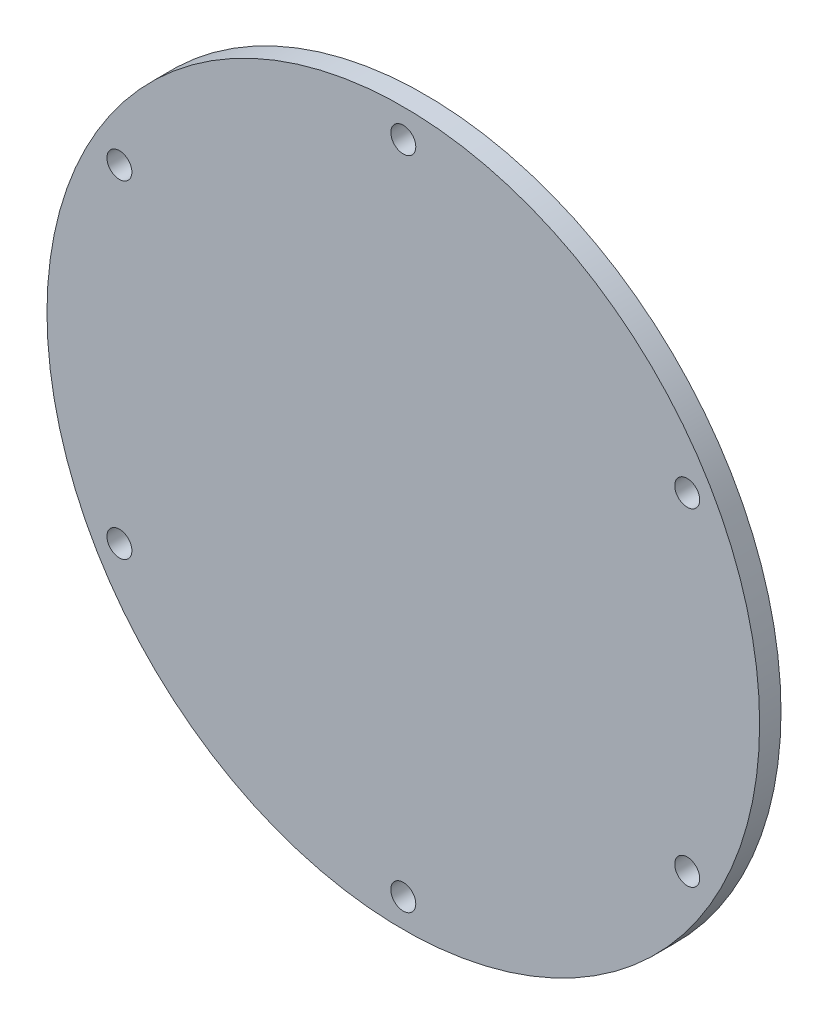
ISO-10303-21;
HEADER;
FILE_DESCRIPTION(('STEP AP214'),'2;1');
FILE_NAME('part.step','',(''),(''),'','','');
FILE_SCHEMA(('AUTOMOTIVE_DESIGN { 1 0 10303 214 1 1 1 1 }'));
ENDSEC;
DATA;
#1=APPLICATION_CONTEXT('core data for automotive mechanical design processes');
#2=APPLICATION_PROTOCOL_DEFINITION('international standard','automotive_design',2000,#1);
#3=PRODUCT_CONTEXT('',#1,'mechanical');
#4=PRODUCT('Part','Part','',(#3));
#5=PRODUCT_RELATED_PRODUCT_CATEGORY('part','',(#4));
#6=PRODUCT_DEFINITION_FORMATION('','',#4);
#7=PRODUCT_DEFINITION_CONTEXT('part definition',#1,'design');
#8=PRODUCT_DEFINITION('design','',#6,#7);
#9=PRODUCT_DEFINITION_SHAPE('','',#8);
#10=(LENGTH_UNIT() NAMED_UNIT(*) SI_UNIT(.MILLI.,.METRE.));
#11=(NAMED_UNIT(*) PLANE_ANGLE_UNIT() SI_UNIT($,.RADIAN.));
#12=(NAMED_UNIT(*) SI_UNIT($,.STERADIAN.) SOLID_ANGLE_UNIT());
#13=UNCERTAINTY_MEASURE_WITH_UNIT(LENGTH_MEASURE(1.E-05),#10,'distance_accuracy_value','');
#14=(GEOMETRIC_REPRESENTATION_CONTEXT(3) GLOBAL_UNCERTAINTY_ASSIGNED_CONTEXT((#13)) GLOBAL_UNIT_ASSIGNED_CONTEXT((#10,
#11,#12)) REPRESENTATION_CONTEXT('',''));
#15=CARTESIAN_POINT('',(0.,0.,0.));
#16=DIRECTION('',(0.,0.,1.));
#17=DIRECTION('',(1.,0.,0.));
#18=AXIS2_PLACEMENT_3D('',#15,#16,#17);
#19=CARTESIAN_POINT('',(0.,0.,3.));
#20=DIRECTION('',(0.,0.,1.));
#21=DIRECTION('',(1.,0.,0.));
#22=AXIS2_PLACEMENT_3D('',#19,#20,#21);
#23=PLANE('',#22);
#24=CARTESIAN_POINT('',(-39.8371685740842,-23.,3.));
#25=DIRECTION('',(0.,0.,1.));
#26=DIRECTION('',(1.,0.,0.));
#27=AXIS2_PLACEMENT_3D('',#24,#25,#26);
#28=CIRCLE('',#27,1.75);
#29=CARTESIAN_POINT('',(-38.0871685740842,-23.,3.));
#30=VERTEX_POINT('',#29);
#31=EDGE_CURVE('E67',#30,#30,#28,.T.);
#32=ORIENTED_EDGE('',*,*,#31,.F.);
#33=EDGE_LOOP('',(#32));
#34=FACE_BOUND('',#33,.T.);
#35=CARTESIAN_POINT('',(39.8371685740842,-23.,3.));
#36=DIRECTION('',(0.,0.,1.));
#37=DIRECTION('',(1.,0.,0.));
#38=AXIS2_PLACEMENT_3D('',#35,#36,#37);
#39=CIRCLE('',#38,1.75);
#40=CARTESIAN_POINT('',(41.5871685740842,-23.,3.));
#41=VERTEX_POINT('',#40);
#42=EDGE_CURVE('E55',#41,#41,#39,.T.);
#43=ORIENTED_EDGE('',*,*,#42,.F.);
#44=EDGE_LOOP('',(#43));
#45=FACE_BOUND('',#44,.T.);
#46=CARTESIAN_POINT('',(0.,46.,3.));
#47=DIRECTION('',(0.,0.,1.));
#48=DIRECTION('',(1.,0.,0.));
#49=AXIS2_PLACEMENT_3D('',#46,#47,#48);
#50=CIRCLE('',#49,1.75);
#51=CARTESIAN_POINT('',(1.75,46.,3.));
#52=VERTEX_POINT('',#51);
#53=EDGE_CURVE('E44',#52,#52,#50,.T.);
#54=ORIENTED_EDGE('',*,*,#53,.F.);
#55=EDGE_LOOP('',(#54));
#56=FACE_BOUND('',#55,.T.);
#57=CARTESIAN_POINT('',(0.,0.,3.));
#58=DIRECTION('',(0.,0.,1.));
#59=DIRECTION('',(1.,0.,0.));
#60=AXIS2_PLACEMENT_3D('',#57,#58,#59);
#61=CIRCLE('',#60,50.);
#62=CARTESIAN_POINT('',(50.,0.,3.));
#63=VERTEX_POINT('',#62);
#64=EDGE_CURVE('E10',#63,#63,#61,.T.);
#65=ORIENTED_EDGE('',*,*,#64,.T.);
#66=EDGE_LOOP('',(#65));
#67=FACE_BOUND('',#66,.T.);
#68=CARTESIAN_POINT('',(39.8371685740842,23.,3.));
#69=DIRECTION('',(0.,0.,1.));
#70=DIRECTION('',(1.,0.,0.));
#71=AXIS2_PLACEMENT_3D('',#68,#69,#70);
#72=CIRCLE('',#71,1.75);
#73=CARTESIAN_POINT('',(41.5871685740842,23.,3.));
#74=VERTEX_POINT('',#73);
#75=EDGE_CURVE('E49',#74,#74,#72,.T.);
#76=ORIENTED_EDGE('',*,*,#75,.F.);
#77=EDGE_LOOP('',(#76));
#78=FACE_BOUND('',#77,.T.);
#79=CARTESIAN_POINT('',(0.,-46.,3.));
#80=DIRECTION('',(0.,0.,1.));
#81=DIRECTION('',(1.,0.,0.));
#82=AXIS2_PLACEMENT_3D('',#79,#80,#81);
#83=CIRCLE('',#82,1.75);
#84=CARTESIAN_POINT('',(1.75000000000001,-46.,3.));
#85=VERTEX_POINT('',#84);
#86=EDGE_CURVE('E61',#85,#85,#83,.T.);
#87=ORIENTED_EDGE('',*,*,#86,.F.);
#88=EDGE_LOOP('',(#87));
#89=FACE_BOUND('',#88,.T.);
#90=CARTESIAN_POINT('',(-39.8371685740842,23.,3.));
#91=DIRECTION('',(0.,0.,1.));
#92=DIRECTION('',(1.,0.,0.));
#93=AXIS2_PLACEMENT_3D('',#90,#91,#92);
#94=CIRCLE('',#93,1.75);
#95=CARTESIAN_POINT('',(-38.0871685740842,23.,3.));
#96=VERTEX_POINT('',#95);
#97=EDGE_CURVE('E73',#96,#96,#94,.T.);
#98=ORIENTED_EDGE('',*,*,#97,.F.);
#99=EDGE_LOOP('',(#98));
#100=FACE_BOUND('',#99,.T.);
#101=ADVANCED_FACE('F33',(#34,#45,#56,#67,#78,#89,#100),#23,.T.);
#102=CARTESIAN_POINT('',(0.,0.,0.));
#103=DIRECTION('',(0.,0.,1.));
#104=DIRECTION('',(1.,0.,0.));
#105=AXIS2_PLACEMENT_3D('',#102,#103,#104);
#106=PLANE('',#105);
#107=CARTESIAN_POINT('',(0.,0.,0.));
#108=DIRECTION('',(0.,0.,1.));
#109=DIRECTION('',(1.,0.,0.));
#110=AXIS2_PLACEMENT_3D('',#107,#108,#109);
#111=CIRCLE('',#110,50.);
#112=CARTESIAN_POINT('',(50.,0.,0.));
#113=VERTEX_POINT('',#112);
#114=EDGE_CURVE('E37',#113,#113,#111,.T.);
#115=ORIENTED_EDGE('',*,*,#114,.F.);
#116=EDGE_LOOP('',(#115));
#117=FACE_BOUND('',#116,.T.);
#118=CARTESIAN_POINT('',(0.,46.,0.));
#119=DIRECTION('',(0.,0.,1.));
#120=DIRECTION('',(1.,0.,0.));
#121=AXIS2_PLACEMENT_3D('',#118,#119,#120);
#122=CIRCLE('',#121,1.75);
#123=CARTESIAN_POINT('',(1.75,46.,0.));
#124=VERTEX_POINT('',#123);
#125=EDGE_CURVE('E46',#124,#124,#122,.T.);
#126=ORIENTED_EDGE('',*,*,#125,.T.);
#127=EDGE_LOOP('',(#126));
#128=FACE_BOUND('',#127,.T.);
#129=CARTESIAN_POINT('',(39.8371685740842,23.,0.));
#130=DIRECTION('',(0.,0.,1.));
#131=DIRECTION('',(1.,0.,0.));
#132=AXIS2_PLACEMENT_3D('',#129,#130,#131);
#133=CIRCLE('',#132,1.75);
#134=CARTESIAN_POINT('',(41.5871685740842,23.,0.));
#135=VERTEX_POINT('',#134);
#136=EDGE_CURVE('E52',#135,#135,#133,.T.);
#137=ORIENTED_EDGE('',*,*,#136,.T.);
#138=EDGE_LOOP('',(#137));
#139=FACE_BOUND('',#138,.T.);
#140=CARTESIAN_POINT('',(39.8371685740842,-23.,0.));
#141=DIRECTION('',(0.,0.,1.));
#142=DIRECTION('',(1.,0.,0.));
#143=AXIS2_PLACEMENT_3D('',#140,#141,#142);
#144=CIRCLE('',#143,1.75);
#145=CARTESIAN_POINT('',(41.5871685740842,-23.,0.));
#146=VERTEX_POINT('',#145);
#147=EDGE_CURVE('E58',#146,#146,#144,.T.);
#148=ORIENTED_EDGE('',*,*,#147,.T.);
#149=EDGE_LOOP('',(#148));
#150=FACE_BOUND('',#149,.T.);
#151=CARTESIAN_POINT('',(0.,-46.,0.));
#152=DIRECTION('',(0.,0.,1.));
#153=DIRECTION('',(1.,0.,0.));
#154=AXIS2_PLACEMENT_3D('',#151,#152,#153);
#155=CIRCLE('',#154,1.75);
#156=CARTESIAN_POINT('',(1.75000000000001,-46.,0.));
#157=VERTEX_POINT('',#156);
#158=EDGE_CURVE('E64',#157,#157,#155,.T.);
#159=ORIENTED_EDGE('',*,*,#158,.T.);
#160=EDGE_LOOP('',(#159));
#161=FACE_BOUND('',#160,.T.);
#162=CARTESIAN_POINT('',(-39.8371685740842,-23.,0.));
#163=DIRECTION('',(0.,0.,1.));
#164=DIRECTION('',(1.,0.,0.));
#165=AXIS2_PLACEMENT_3D('',#162,#163,#164);
#166=CIRCLE('',#165,1.75);
#167=CARTESIAN_POINT('',(-38.0871685740842,-23.,0.));
#168=VERTEX_POINT('',#167);
#169=EDGE_CURVE('E70',#168,#168,#166,.T.);
#170=ORIENTED_EDGE('',*,*,#169,.T.);
#171=EDGE_LOOP('',(#170));
#172=FACE_BOUND('',#171,.T.);
#173=CARTESIAN_POINT('',(-39.8371685740842,23.,0.));
#174=DIRECTION('',(0.,0.,1.));
#175=DIRECTION('',(1.,0.,0.));
#176=AXIS2_PLACEMENT_3D('',#173,#174,#175);
#177=CIRCLE('',#176,1.75);
#178=CARTESIAN_POINT('',(-38.0871685740842,23.,0.));
#179=VERTEX_POINT('',#178);
#180=EDGE_CURVE('E76',#179,#179,#177,.T.);
#181=ORIENTED_EDGE('',*,*,#180,.T.);
#182=EDGE_LOOP('',(#181));
#183=FACE_BOUND('',#182,.T.);
#184=ADVANCED_FACE('F86',(#117,#128,#139,#150,#161,#172,#183),#106,.F.);
#185=CARTESIAN_POINT('',(0.,0.,3.));
#186=DIRECTION('',(0.,0.,-1.));
#187=DIRECTION('',(-1.,0.,0.));
#188=AXIS2_PLACEMENT_3D('',#185,#186,#187);
#189=CYLINDRICAL_SURFACE('',#188,50.);
#190=ORIENTED_EDGE('',*,*,#64,.F.);
#191=EDGE_LOOP('',(#190));
#192=FACE_BOUND('',#191,.T.);
#193=ORIENTED_EDGE('',*,*,#114,.T.);
#194=EDGE_LOOP('',(#193));
#195=FACE_BOUND('',#194,.T.);
#196=ADVANCED_FACE('F35',(#192,#195),#189,.T.);
#197=CARTESIAN_POINT('',(0.,46.,3.));
#198=DIRECTION('',(0.,0.,-1.));
#199=DIRECTION('',(-1.,0.,0.));
#200=AXIS2_PLACEMENT_3D('',#197,#198,#199);
#201=CYLINDRICAL_SURFACE('',#200,1.75);
#202=ORIENTED_EDGE('',*,*,#53,.T.);
#203=EDGE_LOOP('',(#202));
#204=FACE_BOUND('',#203,.T.);
#205=ORIENTED_EDGE('',*,*,#125,.F.);
#206=EDGE_LOOP('',(#205));
#207=FACE_BOUND('',#206,.T.);
#208=ADVANCED_FACE('F96',(#204,#207),#201,.F.);
#209=CARTESIAN_POINT('',(39.8371685740842,23.,3.));
#210=DIRECTION('',(0.,0.,-1.));
#211=DIRECTION('',(-1.,0.,0.));
#212=AXIS2_PLACEMENT_3D('',#209,#210,#211);
#213=CYLINDRICAL_SURFACE('',#212,1.75);
#214=ORIENTED_EDGE('',*,*,#75,.T.);
#215=EDGE_LOOP('',(#214));
#216=FACE_BOUND('',#215,.T.);
#217=ORIENTED_EDGE('',*,*,#136,.F.);
#218=EDGE_LOOP('',(#217));
#219=FACE_BOUND('',#218,.T.);
#220=ADVANCED_FACE('F99',(#216,#219),#213,.F.);
#221=CARTESIAN_POINT('',(39.8371685740842,-23.,3.));
#222=DIRECTION('',(0.,0.,-1.));
#223=DIRECTION('',(-1.,0.,0.));
#224=AXIS2_PLACEMENT_3D('',#221,#222,#223);
#225=CYLINDRICAL_SURFACE('',#224,1.75);
#226=ORIENTED_EDGE('',*,*,#42,.T.);
#227=EDGE_LOOP('',(#226));
#228=FACE_BOUND('',#227,.T.);
#229=ORIENTED_EDGE('',*,*,#147,.F.);
#230=EDGE_LOOP('',(#229));
#231=FACE_BOUND('',#230,.T.);
#232=ADVANCED_FACE('F103',(#228,#231),#225,.F.);
#233=CARTESIAN_POINT('',(0.,-46.,3.));
#234=DIRECTION('',(0.,0.,-1.));
#235=DIRECTION('',(-1.,0.,0.));
#236=AXIS2_PLACEMENT_3D('',#233,#234,#235);
#237=CYLINDRICAL_SURFACE('',#236,1.75);
#238=ORIENTED_EDGE('',*,*,#86,.T.);
#239=EDGE_LOOP('',(#238));
#240=FACE_BOUND('',#239,.T.);
#241=ORIENTED_EDGE('',*,*,#158,.F.);
#242=EDGE_LOOP('',(#241));
#243=FACE_BOUND('',#242,.T.);
#244=ADVANCED_FACE('F107',(#240,#243),#237,.F.);
#245=CARTESIAN_POINT('',(-39.8371685740842,-23.,3.));
#246=DIRECTION('',(0.,0.,-1.));
#247=DIRECTION('',(-1.,0.,0.));
#248=AXIS2_PLACEMENT_3D('',#245,#246,#247);
#249=CYLINDRICAL_SURFACE('',#248,1.75);
#250=ORIENTED_EDGE('',*,*,#31,.T.);
#251=EDGE_LOOP('',(#250));
#252=FACE_BOUND('',#251,.T.);
#253=ORIENTED_EDGE('',*,*,#169,.F.);
#254=EDGE_LOOP('',(#253));
#255=FACE_BOUND('',#254,.T.);
#256=ADVANCED_FACE('F111',(#252,#255),#249,.F.);
#257=CARTESIAN_POINT('',(-39.8371685740842,23.,3.));
#258=DIRECTION('',(0.,0.,-1.));
#259=DIRECTION('',(-1.,0.,0.));
#260=AXIS2_PLACEMENT_3D('',#257,#258,#259);
#261=CYLINDRICAL_SURFACE('',#260,1.75);
#262=ORIENTED_EDGE('',*,*,#97,.T.);
#263=EDGE_LOOP('',(#262));
#264=FACE_BOUND('',#263,.T.);
#265=ORIENTED_EDGE('',*,*,#180,.F.);
#266=EDGE_LOOP('',(#265));
#267=FACE_BOUND('',#266,.T.);
#268=ADVANCED_FACE('F82',(#264,#267),#261,.F.);
#269=CLOSED_SHELL('',(#101,#184,#196,#208,#220,#232,#244,#256,#268));
#270=MANIFOLD_SOLID_BREP('B2',#269);
#271=ADVANCED_BREP_SHAPE_REPRESENTATION('',(#18,#270),#14);
#272=SHAPE_DEFINITION_REPRESENTATION(#9,#271);
ENDSEC;
END-ISO-10303-21;
